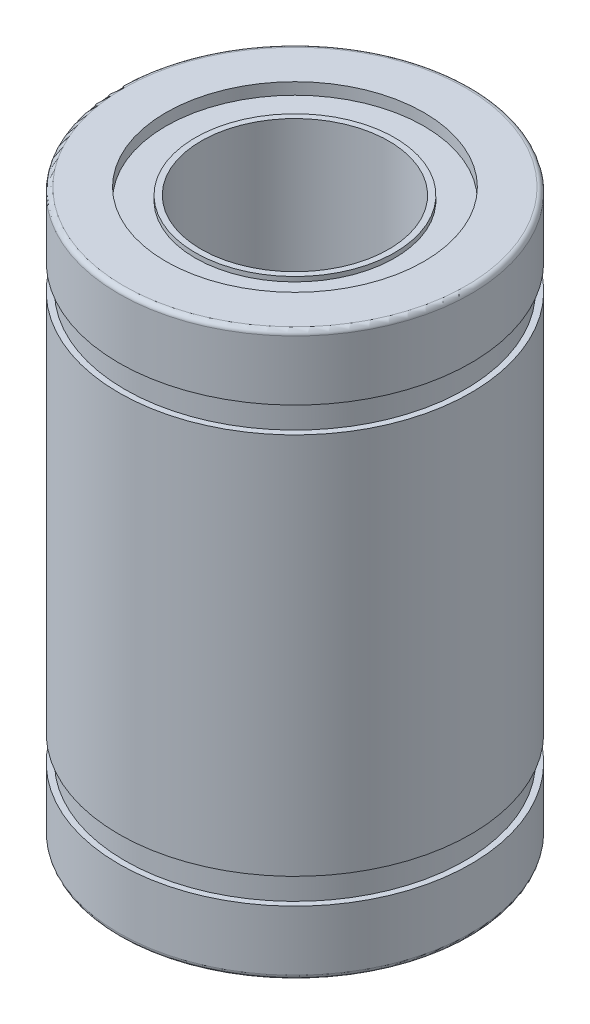
ISO-10303-21;
HEADER;
FILE_DESCRIPTION(('STEP AP214'),'2;1');
FILE_NAME('part.step','',(''),(''),'','','');
FILE_SCHEMA(('AUTOMOTIVE_DESIGN { 1 0 10303 214 1 1 1 1 }'));
ENDSEC;
DATA;
#1=APPLICATION_CONTEXT('core data for automotive mechanical design processes');
#2=APPLICATION_PROTOCOL_DEFINITION('international standard','automotive_design',2000,#1);
#3=PRODUCT_CONTEXT('',#1,'mechanical');
#4=PRODUCT('Part','Part','',(#3));
#5=PRODUCT_RELATED_PRODUCT_CATEGORY('part','',(#4));
#6=PRODUCT_DEFINITION_FORMATION('','',#4);
#7=PRODUCT_DEFINITION_CONTEXT('part definition',#1,'design');
#8=PRODUCT_DEFINITION('design','',#6,#7);
#9=PRODUCT_DEFINITION_SHAPE('','',#8);
#10=(LENGTH_UNIT() NAMED_UNIT(*) SI_UNIT(.MILLI.,.METRE.));
#11=(NAMED_UNIT(*) PLANE_ANGLE_UNIT() SI_UNIT($,.RADIAN.));
#12=(NAMED_UNIT(*) SI_UNIT($,.STERADIAN.) SOLID_ANGLE_UNIT());
#13=UNCERTAINTY_MEASURE_WITH_UNIT(LENGTH_MEASURE(1.E-05),#10,'distance_accuracy_value','');
#14=(GEOMETRIC_REPRESENTATION_CONTEXT(3) GLOBAL_UNCERTAINTY_ASSIGNED_CONTEXT((#13)) GLOBAL_UNIT_ASSIGNED_CONTEXT((#10,
#11,#12)) REPRESENTATION_CONTEXT('',''));
#15=CARTESIAN_POINT('',(0.,0.,0.));
#16=DIRECTION('',(0.,0.,1.));
#17=DIRECTION('',(1.,0.,0.));
#18=AXIS2_PLACEMENT_3D('',#15,#16,#17);
#19=CARTESIAN_POINT('',(0.,0.,0.));
#20=DIRECTION('',(0.,1.,0.));
#21=DIRECTION('',(0.,0.,1.));
#22=AXIS2_PLACEMENT_3D('',#19,#20,#21);
#23=CYLINDRICAL_SURFACE('',#22,4.);
#24=CARTESIAN_POINT('',(0.,23.7,0.));
#25=DIRECTION('',(0.,1.,0.));
#26=DIRECTION('',(0.,0.,1.));
#27=AXIS2_PLACEMENT_3D('',#24,#25,#26);
#28=CIRCLE('',#27,4.);
#29=CARTESIAN_POINT('',(0.,23.7,4.));
#30=VERTEX_POINT('',#29);
#31=EDGE_CURVE('E19',#30,#30,#28,.F.);
#32=ORIENTED_EDGE('',*,*,#31,.F.);
#33=EDGE_LOOP('',(#32));
#34=FACE_BOUND('',#33,.T.);
#35=CARTESIAN_POINT('',(0.,0.299999999999998,0.));
#36=DIRECTION('',(0.,1.,0.));
#37=DIRECTION('',(0.,0.,1.));
#38=AXIS2_PLACEMENT_3D('',#35,#36,#37);
#39=CIRCLE('',#38,4.);
#40=CARTESIAN_POINT('',(0.,0.299999999999998,4.));
#41=VERTEX_POINT('',#40);
#42=EDGE_CURVE('E252',#41,#41,#39,.F.);
#43=ORIENTED_EDGE('',*,*,#42,.T.);
#44=EDGE_LOOP('',(#43));
#45=FACE_BOUND('',#44,.T.);
#46=ADVANCED_FACE('F16',(#34,#45),#23,.F.);
#47=CARTESIAN_POINT('',(0.,23.7,0.));
#48=DIRECTION('',(0.,1.,0.));
#49=DIRECTION('',(0.,0.,1.));
#50=AXIS2_PLACEMENT_3D('',#47,#48,#49);
#51=PLANE('',#50);
#52=ORIENTED_EDGE('',*,*,#31,.T.);
#53=EDGE_LOOP('',(#52));
#54=FACE_BOUND('',#53,.T.);
#55=CARTESIAN_POINT('',(0.,23.7,0.));
#56=DIRECTION('',(0.,1.,0.));
#57=DIRECTION('',(0.,0.,1.));
#58=AXIS2_PLACEMENT_3D('',#55,#56,#57);
#59=CIRCLE('',#58,4.25);
#60=CARTESIAN_POINT('',(0.,23.7,4.25));
#61=VERTEX_POINT('',#60);
#62=EDGE_CURVE('E250',#61,#61,#59,.F.);
#63=ORIENTED_EDGE('',*,*,#62,.F.);
#64=EDGE_LOOP('',(#63));
#65=FACE_BOUND('',#64,.T.);
#66=ADVANCED_FACE('F159',(#54,#65),#51,.T.);
#67=CARTESIAN_POINT('',(0.,0.299999999999998,0.));
#68=DIRECTION('',(0.,1.,0.));
#69=DIRECTION('',(0.,0.,1.));
#70=AXIS2_PLACEMENT_3D('',#67,#68,#69);
#71=PLANE('',#70);
#72=ORIENTED_EDGE('',*,*,#42,.F.);
#73=EDGE_LOOP('',(#72));
#74=FACE_BOUND('',#73,.T.);
#75=CARTESIAN_POINT('',(0.,0.300000000000002,0.));
#76=DIRECTION('',(0.,1.,0.));
#77=DIRECTION('',(0.,0.,1.));
#78=AXIS2_PLACEMENT_3D('',#75,#76,#77);
#79=CIRCLE('',#78,4.25);
#80=CARTESIAN_POINT('',(0.,0.300000000000002,4.25));
#81=VERTEX_POINT('',#80);
#82=EDGE_CURVE('E247',#81,#81,#79,.T.);
#83=ORIENTED_EDGE('',*,*,#82,.F.);
#84=EDGE_LOOP('',(#83));
#85=FACE_BOUND('',#84,.T.);
#86=ADVANCED_FACE('F156',(#74,#85),#71,.F.);
#87=CARTESIAN_POINT('',(0.,23.5,0.));
#88=DIRECTION('',(0.,1.,0.));
#89=DIRECTION('',(0.,0.,1.));
#90=AXIS2_PLACEMENT_3D('',#87,#88,#89);
#91=CYLINDRICAL_SURFACE('',#90,4.25);
#92=CARTESIAN_POINT('',(0.,23.5,0.));
#93=DIRECTION('',(0.,1.,0.));
#94=DIRECTION('',(0.,0.,1.));
#95=AXIS2_PLACEMENT_3D('',#92,#93,#94);
#96=CIRCLE('',#95,4.25);
#97=CARTESIAN_POINT('',(0.,23.5,4.25));
#98=VERTEX_POINT('',#97);
#99=EDGE_CURVE('E244',#98,#98,#96,.F.);
#100=ORIENTED_EDGE('',*,*,#99,.F.);
#101=EDGE_LOOP('',(#100));
#102=FACE_BOUND('',#101,.T.);
#103=ORIENTED_EDGE('',*,*,#62,.T.);
#104=EDGE_LOOP('',(#103));
#105=FACE_BOUND('',#104,.T.);
#106=ADVANCED_FACE('F152',(#102,#105),#91,.T.);
#107=CARTESIAN_POINT('',(0.,0.500000000000003,0.));
#108=DIRECTION('',(0.,1.,0.));
#109=DIRECTION('',(0.,0.,1.));
#110=AXIS2_PLACEMENT_3D('',#107,#108,#109);
#111=CYLINDRICAL_SURFACE('',#110,4.25);
#112=CARTESIAN_POINT('',(0.,0.500000000000003,0.));
#113=DIRECTION('',(0.,1.,0.));
#114=DIRECTION('',(0.,0.,1.));
#115=AXIS2_PLACEMENT_3D('',#112,#113,#114);
#116=CIRCLE('',#115,4.25);
#117=CARTESIAN_POINT('',(0.,0.500000000000003,4.25));
#118=VERTEX_POINT('',#117);
#119=EDGE_CURVE('E241',#118,#118,#116,.F.);
#120=ORIENTED_EDGE('',*,*,#119,.T.);
#121=EDGE_LOOP('',(#120));
#122=FACE_BOUND('',#121,.T.);
#123=ORIENTED_EDGE('',*,*,#82,.T.);
#124=EDGE_LOOP('',(#123));
#125=FACE_BOUND('',#124,.T.);
#126=ADVANCED_FACE('F148',(#122,#125),#111,.T.);
#127=CARTESIAN_POINT('',(0.,23.5,0.));
#128=DIRECTION('',(0.,1.,0.));
#129=DIRECTION('',(0.,0.,1.));
#130=AXIS2_PLACEMENT_3D('',#127,#128,#129);
#131=PLANE('',#130);
#132=ORIENTED_EDGE('',*,*,#99,.T.);
#133=EDGE_LOOP('',(#132));
#134=FACE_BOUND('',#133,.T.);
#135=CARTESIAN_POINT('',(0.,23.5,0.));
#136=DIRECTION('',(0.,-1.,0.));
#137=DIRECTION('',(0.,0.,-1.));
#138=AXIS2_PLACEMENT_3D('',#135,#136,#137);
#139=CIRCLE('',#138,5.5);
#140=CARTESIAN_POINT('',(0.,23.5,-5.5));
#141=VERTEX_POINT('',#140);
#142=EDGE_CURVE('E238',#141,#141,#139,.F.);
#143=ORIENTED_EDGE('',*,*,#142,.T.);
#144=EDGE_LOOP('',(#143));
#145=FACE_BOUND('',#144,.T.);
#146=ADVANCED_FACE('F144',(#134,#145),#131,.T.);
#147=CARTESIAN_POINT('',(0.,0.500000000000003,0.));
#148=DIRECTION('',(0.,1.,0.));
#149=DIRECTION('',(0.,0.,1.));
#150=AXIS2_PLACEMENT_3D('',#147,#148,#149);
#151=PLANE('',#150);
#152=ORIENTED_EDGE('',*,*,#119,.F.);
#153=EDGE_LOOP('',(#152));
#154=FACE_BOUND('',#153,.T.);
#155=CARTESIAN_POINT('',(0.,0.499999999999998,0.));
#156=DIRECTION('',(0.,-1.,0.));
#157=DIRECTION('',(0.,0.,-1.));
#158=AXIS2_PLACEMENT_3D('',#155,#156,#157);
#159=CIRCLE('',#158,5.5);
#160=CARTESIAN_POINT('',(0.,0.499999999999998,-5.5));
#161=VERTEX_POINT('',#160);
#162=EDGE_CURVE('E235',#161,#161,#159,.T.);
#163=ORIENTED_EDGE('',*,*,#162,.T.);
#164=EDGE_LOOP('',(#163));
#165=FACE_BOUND('',#164,.T.);
#166=ADVANCED_FACE('F140',(#154,#165),#151,.F.);
#167=CARTESIAN_POINT('',(0.,24.,0.));
#168=DIRECTION('',(0.,-1.,0.));
#169=DIRECTION('',(0.,0.,-1.));
#170=AXIS2_PLACEMENT_3D('',#167,#168,#169);
#171=CYLINDRICAL_SURFACE('',#170,5.5);
#172=ORIENTED_EDGE('',*,*,#142,.F.);
#173=EDGE_LOOP('',(#172));
#174=FACE_BOUND('',#173,.T.);
#175=CARTESIAN_POINT('',(0.,24.,0.));
#176=DIRECTION('',(0.,-1.,0.));
#177=DIRECTION('',(0.,0.,-1.));
#178=AXIS2_PLACEMENT_3D('',#175,#176,#177);
#179=CIRCLE('',#178,5.5);
#180=CARTESIAN_POINT('',(0.,24.,-5.5));
#181=VERTEX_POINT('',#180);
#182=EDGE_CURVE('E232',#181,#181,#179,.T.);
#183=ORIENTED_EDGE('',*,*,#182,.F.);
#184=EDGE_LOOP('',(#183));
#185=FACE_BOUND('',#184,.T.);
#186=ADVANCED_FACE('F136',(#174,#185),#171,.F.);
#187=CARTESIAN_POINT('',(0.,0.,0.));
#188=DIRECTION('',(0.,-1.,0.));
#189=DIRECTION('',(0.,0.,-1.));
#190=AXIS2_PLACEMENT_3D('',#187,#188,#189);
#191=CYLINDRICAL_SURFACE('',#190,5.5);
#192=ORIENTED_EDGE('',*,*,#162,.F.);
#193=EDGE_LOOP('',(#192));
#194=FACE_BOUND('',#193,.T.);
#195=CARTESIAN_POINT('',(0.,0.,0.));
#196=DIRECTION('',(0.,-1.,0.));
#197=DIRECTION('',(0.,0.,-1.));
#198=AXIS2_PLACEMENT_3D('',#195,#196,#197);
#199=CIRCLE('',#198,5.5);
#200=CARTESIAN_POINT('',(0.,0.,-5.5));
#201=VERTEX_POINT('',#200);
#202=EDGE_CURVE('E50',#201,#201,#199,.T.);
#203=ORIENTED_EDGE('',*,*,#202,.T.);
#204=EDGE_LOOP('',(#203));
#205=FACE_BOUND('',#204,.T.);
#206=ADVANCED_FACE('F131',(#194,#205),#191,.F.);
#207=CARTESIAN_POINT('',(0.,24.,0.));
#208=DIRECTION('',(0.,1.,0.));
#209=DIRECTION('',(0.,0.,1.));
#210=AXIS2_PLACEMENT_3D('',#207,#208,#209);
#211=PLANE('',#210);
#212=ORIENTED_EDGE('',*,*,#182,.T.);
#213=EDGE_LOOP('',(#212));
#214=FACE_BOUND('',#213,.T.);
#215=CARTESIAN_POINT('',(0.,24.,0.));
#216=DIRECTION('',(0.,-1.,0.));
#217=DIRECTION('',(-1.,0.,0.));
#218=AXIS2_PLACEMENT_3D('',#215,#216,#217);
#219=CIRCLE('',#218,7.3);
#220=CARTESIAN_POINT('',(-7.3,24.,0.));
#221=VERTEX_POINT('',#220);
#222=CARTESIAN_POINT('',(0.,24.,-7.3));
#223=VERTEX_POINT('',#222);
#224=EDGE_CURVE('E42',#221,#223,#219,.T.);
#225=ORIENTED_EDGE('',*,*,#224,.F.);
#226=CARTESIAN_POINT('',(0.,24.,0.));
#227=DIRECTION('',(0.,-1.,0.));
#228=DIRECTION('',(0.,0.,-1.));
#229=AXIS2_PLACEMENT_3D('',#226,#227,#228);
#230=CIRCLE('',#229,7.3);
#231=EDGE_CURVE('E45',#223,#221,#230,.T.);
#232=ORIENTED_EDGE('',*,*,#231,.F.);
#233=EDGE_LOOP('',(#225,#232));
#234=FACE_BOUND('',#233,.T.);
#235=ADVANCED_FACE('F47',(#214,#234),#211,.T.);
#236=CARTESIAN_POINT('',(0.,0.,0.));
#237=DIRECTION('',(0.,1.,0.));
#238=DIRECTION('',(0.,0.,1.));
#239=AXIS2_PLACEMENT_3D('',#236,#237,#238);
#240=PLANE('',#239);
#241=ORIENTED_EDGE('',*,*,#202,.F.);
#242=EDGE_LOOP('',(#241));
#243=FACE_BOUND('',#242,.T.);
#244=CARTESIAN_POINT('',(0.,0.,0.));
#245=DIRECTION('',(0.,1.,0.));
#246=DIRECTION('',(0.,0.,1.));
#247=AXIS2_PLACEMENT_3D('',#244,#245,#246);
#248=CIRCLE('',#247,7.3);
#249=CARTESIAN_POINT('',(0.,0.,7.3));
#250=VERTEX_POINT('',#249);
#251=CARTESIAN_POINT('',(-7.3,0.,0.));
#252=VERTEX_POINT('',#251);
#253=EDGE_CURVE('E55',#250,#252,#248,.T.);
#254=ORIENTED_EDGE('',*,*,#253,.F.);
#255=CARTESIAN_POINT('',(0.,0.,0.));
#256=DIRECTION('',(0.,1.,0.));
#257=DIRECTION('',(-1.,0.,0.));
#258=AXIS2_PLACEMENT_3D('',#255,#256,#257);
#259=CIRCLE('',#258,7.3);
#260=EDGE_CURVE('E33',#252,#250,#259,.T.);
#261=ORIENTED_EDGE('',*,*,#260,.F.);
#262=EDGE_LOOP('',(#254,#261));
#263=FACE_BOUND('',#262,.T.);
#264=ADVANCED_FACE('F75',(#243,#263),#240,.F.);
#265=CARTESIAN_POINT('',(0.,23.8,0.));
#266=DIRECTION('',(0.,1.,0.));
#267=DIRECTION('',(0.,0.,1.));
#268=AXIS2_PLACEMENT_3D('',#265,#266,#267);
#269=TOROIDAL_SURFACE('',#268,7.3,0.2);
#270=CARTESIAN_POINT('',(0.,23.8,0.));
#271=DIRECTION('',(0.,1.,0.));
#272=DIRECTION('',(0.,0.,1.));
#273=AXIS2_PLACEMENT_3D('',#270,#271,#272);
#274=CIRCLE('',#273,7.5);
#275=CARTESIAN_POINT('',(0.,23.8,7.5));
#276=VERTEX_POINT('',#275);
#277=EDGE_CURVE('E218',#276,#276,#274,.F.);
#278=ORIENTED_EDGE('',*,*,#277,.F.);
#279=EDGE_LOOP('',(#278));
#280=FACE_BOUND('',#279,.T.);
#281=ORIENTED_EDGE('',*,*,#224,.T.);
#282=ORIENTED_EDGE('',*,*,#231,.T.);
#283=EDGE_LOOP('',(#281,#282));
#284=FACE_BOUND('',#283,.T.);
#285=ADVANCED_FACE('F54',(#280,#284),#269,.T.);
#286=CARTESIAN_POINT('',(0.,0.2,0.));
#287=DIRECTION('',(0.,-1.,0.));
#288=DIRECTION('',(0.,0.,-1.));
#289=AXIS2_PLACEMENT_3D('',#286,#287,#288);
#290=TOROIDAL_SURFACE('',#289,7.3,0.2);
#291=CARTESIAN_POINT('',(0.,0.2,0.));
#292=DIRECTION('',(0.,1.,0.));
#293=DIRECTION('',(0.,0.,1.));
#294=AXIS2_PLACEMENT_3D('',#291,#292,#293);
#295=CIRCLE('',#294,7.5);
#296=CARTESIAN_POINT('',(0.,0.2,7.5));
#297=VERTEX_POINT('',#296);
#298=EDGE_CURVE('E219',#297,#297,#295,.T.);
#299=ORIENTED_EDGE('',*,*,#298,.F.);
#300=EDGE_LOOP('',(#299));
#301=FACE_BOUND('',#300,.T.);
#302=ORIENTED_EDGE('',*,*,#260,.T.);
#303=ORIENTED_EDGE('',*,*,#253,.T.);
#304=EDGE_LOOP('',(#302,#303));
#305=FACE_BOUND('',#304,.T.);
#306=ADVANCED_FACE('F74',(#301,#305),#290,.T.);
#307=CARTESIAN_POINT('',(0.,0.,0.));
#308=DIRECTION('',(0.,1.,0.));
#309=DIRECTION('',(0.,0.,1.));
#310=AXIS2_PLACEMENT_3D('',#307,#308,#309);
#311=CYLINDRICAL_SURFACE('',#310,7.5);
#312=CARTESIAN_POINT('',(0.,21.25,0.));
#313=DIRECTION('',(0.,1.,0.));
#314=DIRECTION('',(0.,0.,1.));
#315=AXIS2_PLACEMENT_3D('',#312,#313,#314);
#316=CIRCLE('',#315,7.5);
#317=CARTESIAN_POINT('',(0.,21.25,7.5));
#318=VERTEX_POINT('',#317);
#319=EDGE_CURVE('E215',#318,#318,#316,.T.);
#320=ORIENTED_EDGE('',*,*,#319,.T.);
#321=EDGE_LOOP('',(#320));
#322=FACE_BOUND('',#321,.T.);
#323=ORIENTED_EDGE('',*,*,#277,.T.);
#324=EDGE_LOOP('',(#323));
#325=FACE_BOUND('',#324,.T.);
#326=ADVANCED_FACE('F204',(#322,#325),#311,.T.);
#327=CARTESIAN_POINT('',(0.,0.,0.));
#328=DIRECTION('',(0.,1.,0.));
#329=DIRECTION('',(0.,0.,1.));
#330=AXIS2_PLACEMENT_3D('',#327,#328,#329);
#331=CYLINDRICAL_SURFACE('',#330,7.5);
#332=ORIENTED_EDGE('',*,*,#298,.T.);
#333=EDGE_LOOP('',(#332));
#334=FACE_BOUND('',#333,.T.);
#335=CARTESIAN_POINT('',(0.,2.74999999999999,0.));
#336=DIRECTION('',(0.,1.,0.));
#337=DIRECTION('',(0.,0.,1.));
#338=AXIS2_PLACEMENT_3D('',#335,#336,#337);
#339=CIRCLE('',#338,7.5);
#340=CARTESIAN_POINT('',(0.,2.74999999999999,7.5));
#341=VERTEX_POINT('',#340);
#342=EDGE_CURVE('E223',#341,#341,#339,.T.);
#343=ORIENTED_EDGE('',*,*,#342,.F.);
#344=EDGE_LOOP('',(#343));
#345=FACE_BOUND('',#344,.T.);
#346=ADVANCED_FACE('F201',(#334,#345),#331,.T.);
#347=CARTESIAN_POINT('',(7.81077606050341,21.25,0.));
#348=DIRECTION('',(0.,1.,0.));
#349=DIRECTION('',(0.,0.,1.));
#350=AXIS2_PLACEMENT_3D('',#347,#348,#349);
#351=PLANE('',#350);
#352=CARTESIAN_POINT('',(0.,21.25,0.));
#353=DIRECTION('',(0.,-1.,0.));
#354=DIRECTION('',(0.,0.,-1.));
#355=AXIS2_PLACEMENT_3D('',#352,#353,#354);
#356=CIRCLE('',#355,7.25);
#357=CARTESIAN_POINT('',(0.,21.25,-7.25));
#358=VERTEX_POINT('',#357);
#359=EDGE_CURVE('E226',#358,#358,#356,.T.);
#360=ORIENTED_EDGE('',*,*,#359,.F.);
#361=EDGE_LOOP('',(#360));
#362=FACE_BOUND('',#361,.T.);
#363=ORIENTED_EDGE('',*,*,#319,.F.);
#364=EDGE_LOOP('',(#363));
#365=FACE_BOUND('',#364,.T.);
#366=ADVANCED_FACE('F197',(#362,#365),#351,.F.);
#367=CARTESIAN_POINT('',(7.81077606050341,2.74999999999999,0.));
#368=DIRECTION('',(0.,1.,0.));
#369=DIRECTION('',(0.,0.,1.));
#370=AXIS2_PLACEMENT_3D('',#367,#368,#369);
#371=PLANE('',#370);
#372=CARTESIAN_POINT('',(0.,2.75,0.));
#373=DIRECTION('',(0.,-1.,0.));
#374=DIRECTION('',(0.,0.,-1.));
#375=AXIS2_PLACEMENT_3D('',#372,#373,#374);
#376=CIRCLE('',#375,7.25);
#377=CARTESIAN_POINT('',(0.,2.75,-7.25));
#378=VERTEX_POINT('',#377);
#379=EDGE_CURVE('E476',#378,#378,#376,.F.);
#380=ORIENTED_EDGE('',*,*,#379,.F.);
#381=EDGE_LOOP('',(#380));
#382=FACE_BOUND('',#381,.T.);
#383=ORIENTED_EDGE('',*,*,#342,.T.);
#384=EDGE_LOOP('',(#383));
#385=FACE_BOUND('',#384,.T.);
#386=ADVANCED_FACE('F193',(#382,#385),#371,.T.);
#387=CARTESIAN_POINT('',(0.,20.7,0.));
#388=DIRECTION('',(0.,-1.,0.));
#389=DIRECTION('',(0.,0.,-1.));
#390=AXIS2_PLACEMENT_3D('',#387,#388,#389);
#391=CYLINDRICAL_SURFACE('',#390,7.25);
#392=CARTESIAN_POINT('',(0.,20.15,0.));
#393=DIRECTION('',(0.,-1.,0.));
#394=DIRECTION('',(0.,0.,-1.));
#395=AXIS2_PLACEMENT_3D('',#392,#393,#394);
#396=CIRCLE('',#395,7.25);
#397=CARTESIAN_POINT('',(0.,20.15,-7.25));
#398=VERTEX_POINT('',#397);
#399=EDGE_CURVE('E479',#398,#398,#396,.F.);
#400=ORIENTED_EDGE('',*,*,#399,.T.);
#401=EDGE_LOOP('',(#400));
#402=FACE_BOUND('',#401,.T.);
#403=ORIENTED_EDGE('',*,*,#359,.T.);
#404=EDGE_LOOP('',(#403));
#405=FACE_BOUND('',#404,.T.);
#406=ADVANCED_FACE('F189',(#402,#405),#391,.T.);
#407=CARTESIAN_POINT('',(0.,3.3,0.));
#408=DIRECTION('',(0.,-1.,0.));
#409=DIRECTION('',(0.,0.,-1.));
#410=AXIS2_PLACEMENT_3D('',#407,#408,#409);
#411=CYLINDRICAL_SURFACE('',#410,7.25);
#412=CARTESIAN_POINT('',(0.,3.85,0.));
#413=DIRECTION('',(0.,-1.,0.));
#414=DIRECTION('',(0.,0.,-1.));
#415=AXIS2_PLACEMENT_3D('',#412,#413,#414);
#416=CIRCLE('',#415,7.25);
#417=CARTESIAN_POINT('',(0.,3.85,-7.25));
#418=VERTEX_POINT('',#417);
#419=EDGE_CURVE('E482',#418,#418,#416,.F.);
#420=ORIENTED_EDGE('',*,*,#419,.F.);
#421=EDGE_LOOP('',(#420));
#422=FACE_BOUND('',#421,.T.);
#423=ORIENTED_EDGE('',*,*,#379,.T.);
#424=EDGE_LOOP('',(#423));
#425=FACE_BOUND('',#424,.T.);
#426=ADVANCED_FACE('F185',(#422,#425),#411,.T.);
#427=CARTESIAN_POINT('',(7.25,20.15,0.));
#428=DIRECTION('',(0.,-1.,0.));
#429=DIRECTION('',(0.,0.,-1.));
#430=AXIS2_PLACEMENT_3D('',#427,#428,#429);
#431=PLANE('',#430);
#432=ORIENTED_EDGE('',*,*,#399,.F.);
#433=EDGE_LOOP('',(#432));
#434=FACE_BOUND('',#433,.T.);
#435=CARTESIAN_POINT('',(0.,20.15,0.));
#436=DIRECTION('',(0.,1.,0.));
#437=DIRECTION('',(0.,0.,1.));
#438=AXIS2_PLACEMENT_3D('',#435,#436,#437);
#439=CIRCLE('',#438,7.5);
#440=CARTESIAN_POINT('',(0.,20.15,7.5));
#441=VERTEX_POINT('',#440);
#442=EDGE_CURVE('E25',#441,#441,#439,.F.);
#443=ORIENTED_EDGE('',*,*,#442,.F.);
#444=EDGE_LOOP('',(#443));
#445=FACE_BOUND('',#444,.T.);
#446=ADVANCED_FACE('F178',(#434,#445),#431,.F.);
#447=CARTESIAN_POINT('',(7.25,3.85,0.));
#448=DIRECTION('',(0.,-1.,0.));
#449=DIRECTION('',(0.,0.,-1.));
#450=AXIS2_PLACEMENT_3D('',#447,#448,#449);
#451=PLANE('',#450);
#452=ORIENTED_EDGE('',*,*,#419,.T.);
#453=EDGE_LOOP('',(#452));
#454=FACE_BOUND('',#453,.T.);
#455=CARTESIAN_POINT('',(0.,3.85,0.));
#456=DIRECTION('',(0.,1.,0.));
#457=DIRECTION('',(0.,0.,1.));
#458=AXIS2_PLACEMENT_3D('',#455,#456,#457);
#459=CIRCLE('',#458,7.5);
#460=CARTESIAN_POINT('',(0.,3.85,7.5));
#461=VERTEX_POINT('',#460);
#462=EDGE_CURVE('E11',#461,#461,#459,.T.);
#463=ORIENTED_EDGE('',*,*,#462,.F.);
#464=EDGE_LOOP('',(#463));
#465=FACE_BOUND('',#464,.T.);
#466=ADVANCED_FACE('F172',(#454,#465),#451,.T.);
#467=CARTESIAN_POINT('',(0.,0.,0.));
#468=DIRECTION('',(0.,1.,0.));
#469=DIRECTION('',(0.,0.,1.));
#470=AXIS2_PLACEMENT_3D('',#467,#468,#469);
#471=CYLINDRICAL_SURFACE('',#470,7.5);
#472=ORIENTED_EDGE('',*,*,#462,.T.);
#473=EDGE_LOOP('',(#472));
#474=FACE_BOUND('',#473,.T.);
#475=ORIENTED_EDGE('',*,*,#442,.T.);
#476=EDGE_LOOP('',(#475));
#477=FACE_BOUND('',#476,.T.);
#478=ADVANCED_FACE('F170',(#474,#477),#471,.T.);
#479=CLOSED_SHELL('',(#46,#66,#86,#106,#126,#146,#166,#186,#206,#235,#264,#285,#306,#326,#346,
#366,#386,#406,#426,#446,#466,#478));
#480=MANIFOLD_SOLID_BREP('B1',#479);
#481=ADVANCED_BREP_SHAPE_REPRESENTATION('',(#18,#480),#14);
#482=SHAPE_DEFINITION_REPRESENTATION(#9,#481);
ENDSEC;
END-ISO-10303-21;
